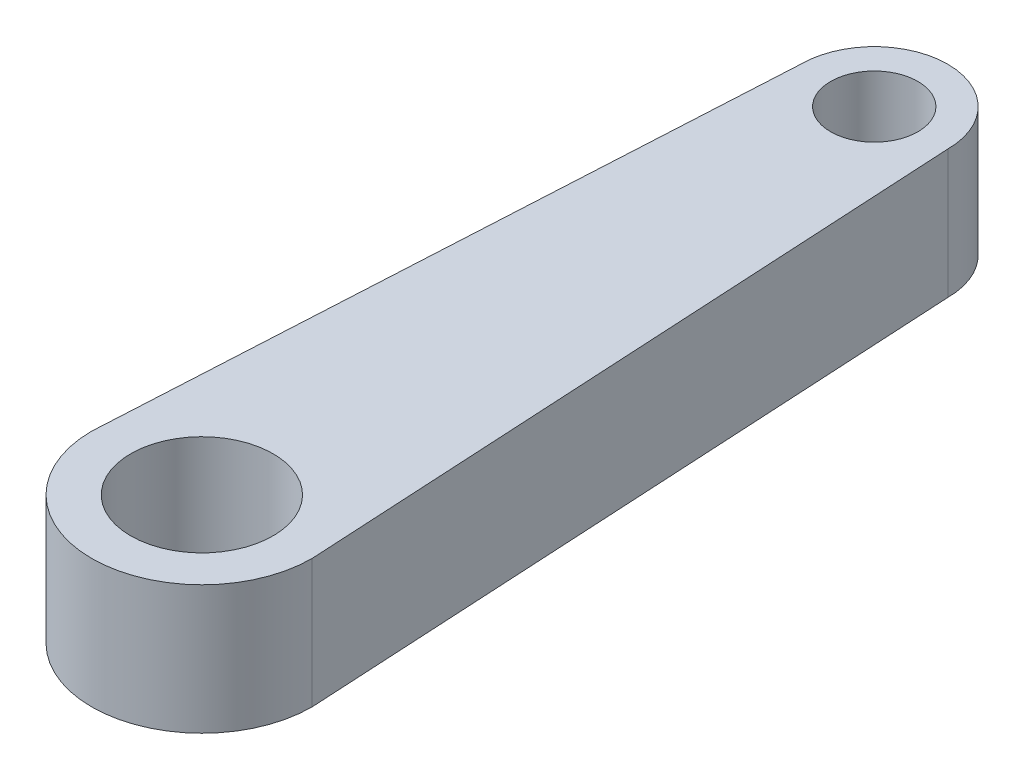
ISO-10303-21;
HEADER;
FILE_DESCRIPTION(('STEP AP214'),'2;1');
FILE_NAME('part.step','',(''),(''),'','','');
FILE_SCHEMA(('AUTOMOTIVE_DESIGN { 1 0 10303 214 1 1 1 1 }'));
ENDSEC;
DATA;
#1=APPLICATION_CONTEXT('core data for automotive mechanical design processes');
#2=APPLICATION_PROTOCOL_DEFINITION('international standard','automotive_design',2000,#1);
#3=PRODUCT_CONTEXT('',#1,'mechanical');
#4=PRODUCT('Part','Part','',(#3));
#5=PRODUCT_RELATED_PRODUCT_CATEGORY('part','',(#4));
#6=PRODUCT_DEFINITION_FORMATION('','',#4);
#7=PRODUCT_DEFINITION_CONTEXT('part definition',#1,'design');
#8=PRODUCT_DEFINITION('design','',#6,#7);
#9=PRODUCT_DEFINITION_SHAPE('','',#8);
#10=(LENGTH_UNIT() NAMED_UNIT(*) SI_UNIT(.MILLI.,.METRE.));
#11=(NAMED_UNIT(*) PLANE_ANGLE_UNIT() SI_UNIT($,.RADIAN.));
#12=(NAMED_UNIT(*) SI_UNIT($,.STERADIAN.) SOLID_ANGLE_UNIT());
#13=UNCERTAINTY_MEASURE_WITH_UNIT(LENGTH_MEASURE(1.E-05),#10,'distance_accuracy_value','');
#14=(GEOMETRIC_REPRESENTATION_CONTEXT(3) GLOBAL_UNCERTAINTY_ASSIGNED_CONTEXT((#13)) GLOBAL_UNIT_ASSIGNED_CONTEXT((#10,
#11,#12)) REPRESENTATION_CONTEXT('',''));
#15=CARTESIAN_POINT('',(0.,0.,0.));
#16=DIRECTION('',(0.,0.,1.));
#17=DIRECTION('',(1.,0.,0.));
#18=AXIS2_PLACEMENT_3D('',#15,#16,#17);
#19=CARTESIAN_POINT('',(0.,7.,0.));
#20=DIRECTION('',(0.,1.,0.));
#21=DIRECTION('',(0.,0.,1.));
#22=AXIS2_PLACEMENT_3D('',#19,#20,#21);
#23=PLANE('',#22);
#24=CARTESIAN_POINT('',(0.,7.,0.));
#25=DIRECTION('',(0.,1.,0.));
#26=DIRECTION('',(0.,0.,1.));
#27=AXIS2_PLACEMENT_3D('',#24,#25,#26);
#28=CIRCLE('',#27,3.875);
#29=CARTESIAN_POINT('',(0.,7.,3.875));
#30=VERTEX_POINT('',#29);
#31=EDGE_CURVE('E110',#30,#30,#28,.T.);
#32=ORIENTED_EDGE('',*,*,#31,.F.);
#33=EDGE_LOOP('',(#32));
#34=FACE_BOUND('',#33,.T.);
#35=CARTESIAN_POINT('',(0.,7.,0.));
#36=DIRECTION('',(0.,1.,0.));
#37=DIRECTION('',(0.,0.,1.));
#38=AXIS2_PLACEMENT_3D('',#35,#36,#37);
#39=CIRCLE('',#38,6.);
#40=CARTESIAN_POINT('',(-6.,7.,0.));
#41=VERTEX_POINT('',#40);
#42=CARTESIAN_POINT('',(6.,7.,0.));
#43=VERTEX_POINT('',#42);
#44=EDGE_CURVE('E95',#41,#43,#39,.T.);
#45=ORIENTED_EDGE('',*,*,#44,.T.);
#46=DIRECTION('',(-0.0545634047998336,0.,-0.998510307836954));
#47=VECTOR('',#46,1.);
#48=CARTESIAN_POINT('',(6.,7.,0.));
#49=LINE('',#48,#47);
#50=CARTESIAN_POINT('',(4.,7.,-36.6));
#51=VERTEX_POINT('',#50);
#52=EDGE_CURVE('E90',#43,#51,#49,.T.);
#53=ORIENTED_EDGE('',*,*,#52,.T.);
#54=CARTESIAN_POINT('',(0.,7.,-36.6));
#55=DIRECTION('',(0.,1.,0.));
#56=DIRECTION('',(0.,0.,1.));
#57=AXIS2_PLACEMENT_3D('',#54,#55,#56);
#58=CIRCLE('',#57,4.);
#59=CARTESIAN_POINT('',(-4.,7.,-36.6));
#60=VERTEX_POINT('',#59);
#61=EDGE_CURVE('E93',#51,#60,#58,.T.);
#62=ORIENTED_EDGE('',*,*,#61,.T.);
#63=DIRECTION('',(-0.0545634047998336,0.,0.998510307836954));
#64=VECTOR('',#63,1.);
#65=CARTESIAN_POINT('',(-6.,7.,0.));
#66=LINE('',#65,#64);
#67=EDGE_CURVE('E60',#60,#41,#66,.T.);
#68=ORIENTED_EDGE('',*,*,#67,.T.);
#69=EDGE_LOOP('',(#45,#53,#62,#68));
#70=FACE_BOUND('',#69,.T.);
#71=CARTESIAN_POINT('',(0.,7.,-36.6));
#72=DIRECTION('',(0.,1.,0.));
#73=DIRECTION('',(0.,0.,1.));
#74=AXIS2_PLACEMENT_3D('',#71,#72,#73);
#75=CIRCLE('',#74,2.375);
#76=CARTESIAN_POINT('',(0.,7.,-34.225));
#77=VERTEX_POINT('',#76);
#78=EDGE_CURVE('E125',#77,#77,#75,.T.);
#79=ORIENTED_EDGE('',*,*,#78,.F.);
#80=EDGE_LOOP('',(#79));
#81=FACE_BOUND('',#80,.T.);
#82=ADVANCED_FACE('F43',(#34,#70,#81),#23,.T.);
#83=CARTESIAN_POINT('',(0.,0.,0.));
#84=DIRECTION('',(0.,1.,0.));
#85=DIRECTION('',(0.,0.,1.));
#86=AXIS2_PLACEMENT_3D('',#83,#84,#85);
#87=PLANE('',#86);
#88=CARTESIAN_POINT('',(0.,0.,0.));
#89=DIRECTION('',(0.,1.,0.));
#90=DIRECTION('',(0.,0.,1.));
#91=AXIS2_PLACEMENT_3D('',#88,#89,#90);
#92=CIRCLE('',#91,6.);
#93=CARTESIAN_POINT('',(-6.,0.,0.));
#94=VERTEX_POINT('',#93);
#95=CARTESIAN_POINT('',(6.,0.,0.));
#96=VERTEX_POINT('',#95);
#97=EDGE_CURVE('E107',#94,#96,#92,.T.);
#98=ORIENTED_EDGE('',*,*,#97,.F.);
#99=DIRECTION('',(-0.0545634047998336,0.,0.998510307836954));
#100=VECTOR('',#99,1.);
#101=CARTESIAN_POINT('',(-6.,0.,0.));
#102=LINE('',#101,#100);
#103=CARTESIAN_POINT('',(-4.,0.,-36.6));
#104=VERTEX_POINT('',#103);
#105=EDGE_CURVE('E83',#104,#94,#102,.T.);
#106=ORIENTED_EDGE('',*,*,#105,.F.);
#107=CARTESIAN_POINT('',(0.,0.,-36.6));
#108=DIRECTION('',(0.,1.,0.));
#109=DIRECTION('',(0.,0.,1.));
#110=AXIS2_PLACEMENT_3D('',#107,#108,#109);
#111=CIRCLE('',#110,4.);
#112=CARTESIAN_POINT('',(4.,0.,-36.6));
#113=VERTEX_POINT('',#112);
#114=EDGE_CURVE('E77',#113,#104,#111,.T.);
#115=ORIENTED_EDGE('',*,*,#114,.F.);
#116=DIRECTION('',(-0.0545634047998336,0.,-0.998510307836954));
#117=VECTOR('',#116,1.);
#118=CARTESIAN_POINT('',(6.,0.,0.));
#119=LINE('',#118,#117);
#120=EDGE_CURVE('E99',#96,#113,#119,.T.);
#121=ORIENTED_EDGE('',*,*,#120,.F.);
#122=EDGE_LOOP('',(#98,#106,#115,#121));
#123=FACE_BOUND('',#122,.T.);
#124=CARTESIAN_POINT('',(0.,0.,0.));
#125=DIRECTION('',(0.,1.,0.));
#126=DIRECTION('',(0.,0.,1.));
#127=AXIS2_PLACEMENT_3D('',#124,#125,#126);
#128=CIRCLE('',#127,3.875);
#129=CARTESIAN_POINT('',(0.,0.,3.875));
#130=VERTEX_POINT('',#129);
#131=EDGE_CURVE('E122',#130,#130,#128,.T.);
#132=ORIENTED_EDGE('',*,*,#131,.T.);
#133=EDGE_LOOP('',(#132));
#134=FACE_BOUND('',#133,.T.);
#135=CARTESIAN_POINT('',(0.,0.,-36.6));
#136=DIRECTION('',(0.,1.,0.));
#137=DIRECTION('',(0.,0.,1.));
#138=AXIS2_PLACEMENT_3D('',#135,#136,#137);
#139=CIRCLE('',#138,2.375);
#140=CARTESIAN_POINT('',(0.,0.,-34.225));
#141=VERTEX_POINT('',#140);
#142=EDGE_CURVE('E128',#141,#141,#139,.T.);
#143=ORIENTED_EDGE('',*,*,#142,.T.);
#144=EDGE_LOOP('',(#143));
#145=FACE_BOUND('',#144,.T.);
#146=ADVANCED_FACE('F118',(#123,#134,#145),#87,.F.);
#147=CARTESIAN_POINT('',(0.,7.,0.));
#148=DIRECTION('',(0.,-1.,0.));
#149=DIRECTION('',(0.,0.,-1.));
#150=AXIS2_PLACEMENT_3D('',#147,#148,#149);
#151=CYLINDRICAL_SURFACE('',#150,6.);
#152=ORIENTED_EDGE('',*,*,#97,.T.);
#153=DIRECTION('',(0.,-1.,0.));
#154=VECTOR('',#153,1.);
#155=CARTESIAN_POINT('',(6.,7.,0.));
#156=LINE('',#155,#154);
#157=EDGE_CURVE('E11',#43,#96,#156,.T.);
#158=ORIENTED_EDGE('',*,*,#157,.F.);
#159=ORIENTED_EDGE('',*,*,#44,.F.);
#160=DIRECTION('',(0.,-1.,0.));
#161=VECTOR('',#160,1.);
#162=CARTESIAN_POINT('',(-6.,7.,0.));
#163=LINE('',#162,#161);
#164=EDGE_CURVE('E103',#41,#94,#163,.T.);
#165=ORIENTED_EDGE('',*,*,#164,.T.);
#166=EDGE_LOOP('',(#152,#158,#159,#165));
#167=FACE_BOUND('',#166,.T.);
#168=ADVANCED_FACE('F45',(#167),#151,.T.);
#169=CARTESIAN_POINT('',(6.,7.,0.));
#170=DIRECTION('',(-0.998510307836954,0.,0.0545634047998336));
#171=DIRECTION('',(0.0545634047998336,0.,0.998510307836954));
#172=AXIS2_PLACEMENT_3D('',#169,#170,#171);
#173=PLANE('',#172);
#174=ORIENTED_EDGE('',*,*,#120,.T.);
#175=DIRECTION('',(0.,-1.,0.));
#176=VECTOR('',#175,1.);
#177=CARTESIAN_POINT('',(4.,7.,-36.6));
#178=LINE('',#177,#176);
#179=EDGE_CURVE('E52',#51,#113,#178,.T.);
#180=ORIENTED_EDGE('',*,*,#179,.F.);
#181=ORIENTED_EDGE('',*,*,#52,.F.);
#182=ORIENTED_EDGE('',*,*,#157,.T.);
#183=EDGE_LOOP('',(#174,#180,#181,#182));
#184=FACE_BOUND('',#183,.T.);
#185=ADVANCED_FACE('F98',(#184),#173,.F.);
#186=CARTESIAN_POINT('',(0.,7.,-36.6));
#187=DIRECTION('',(0.,-1.,0.));
#188=DIRECTION('',(0.,0.,-1.));
#189=AXIS2_PLACEMENT_3D('',#186,#187,#188);
#190=CYLINDRICAL_SURFACE('',#189,4.);
#191=ORIENTED_EDGE('',*,*,#114,.T.);
#192=DIRECTION('',(0.,-1.,0.));
#193=VECTOR('',#192,1.);
#194=CARTESIAN_POINT('',(-4.,7.,-36.6));
#195=LINE('',#194,#193);
#196=EDGE_CURVE('E100',#60,#104,#195,.T.);
#197=ORIENTED_EDGE('',*,*,#196,.F.);
#198=ORIENTED_EDGE('',*,*,#61,.F.);
#199=ORIENTED_EDGE('',*,*,#179,.T.);
#200=EDGE_LOOP('',(#191,#197,#198,#199));
#201=FACE_BOUND('',#200,.T.);
#202=ADVANCED_FACE('F101',(#201),#190,.T.);
#203=CARTESIAN_POINT('',(-6.,7.,0.));
#204=DIRECTION('',(0.998510307836954,0.,0.0545634047998336));
#205=DIRECTION('',(0.0545634047998336,0.,-0.998510307836954));
#206=AXIS2_PLACEMENT_3D('',#203,#204,#205);
#207=PLANE('',#206);
#208=ORIENTED_EDGE('',*,*,#105,.T.);
#209=ORIENTED_EDGE('',*,*,#164,.F.);
#210=ORIENTED_EDGE('',*,*,#67,.F.);
#211=ORIENTED_EDGE('',*,*,#196,.T.);
#212=EDGE_LOOP('',(#208,#209,#210,#211));
#213=FACE_BOUND('',#212,.T.);
#214=ADVANCED_FACE('F115',(#213),#207,.F.);
#215=CARTESIAN_POINT('',(0.,7.,0.));
#216=DIRECTION('',(0.,-1.,0.));
#217=DIRECTION('',(0.,0.,-1.));
#218=AXIS2_PLACEMENT_3D('',#215,#216,#217);
#219=CYLINDRICAL_SURFACE('',#218,3.875);
#220=ORIENTED_EDGE('',*,*,#31,.T.);
#221=EDGE_LOOP('',(#220));
#222=FACE_BOUND('',#221,.T.);
#223=ORIENTED_EDGE('',*,*,#131,.F.);
#224=EDGE_LOOP('',(#223));
#225=FACE_BOUND('',#224,.T.);
#226=ADVANCED_FACE('F145',(#222,#225),#219,.F.);
#227=CARTESIAN_POINT('',(0.,7.,-36.6));
#228=DIRECTION('',(0.,-1.,0.));
#229=DIRECTION('',(0.,0.,-1.));
#230=AXIS2_PLACEMENT_3D('',#227,#228,#229);
#231=CYLINDRICAL_SURFACE('',#230,2.375);
#232=ORIENTED_EDGE('',*,*,#78,.T.);
#233=EDGE_LOOP('',(#232));
#234=FACE_BOUND('',#233,.T.);
#235=ORIENTED_EDGE('',*,*,#142,.F.);
#236=EDGE_LOOP('',(#235));
#237=FACE_BOUND('',#236,.T.);
#238=ADVANCED_FACE('F134',(#234,#237),#231,.F.);
#239=CLOSED_SHELL('',(#82,#146,#168,#185,#202,#214,#226,#238));
#240=MANIFOLD_SOLID_BREP('B2',#239);
#241=ADVANCED_BREP_SHAPE_REPRESENTATION('',(#18,#240),#14);
#242=SHAPE_DEFINITION_REPRESENTATION(#9,#241);
ENDSEC;
END-ISO-10303-21;
